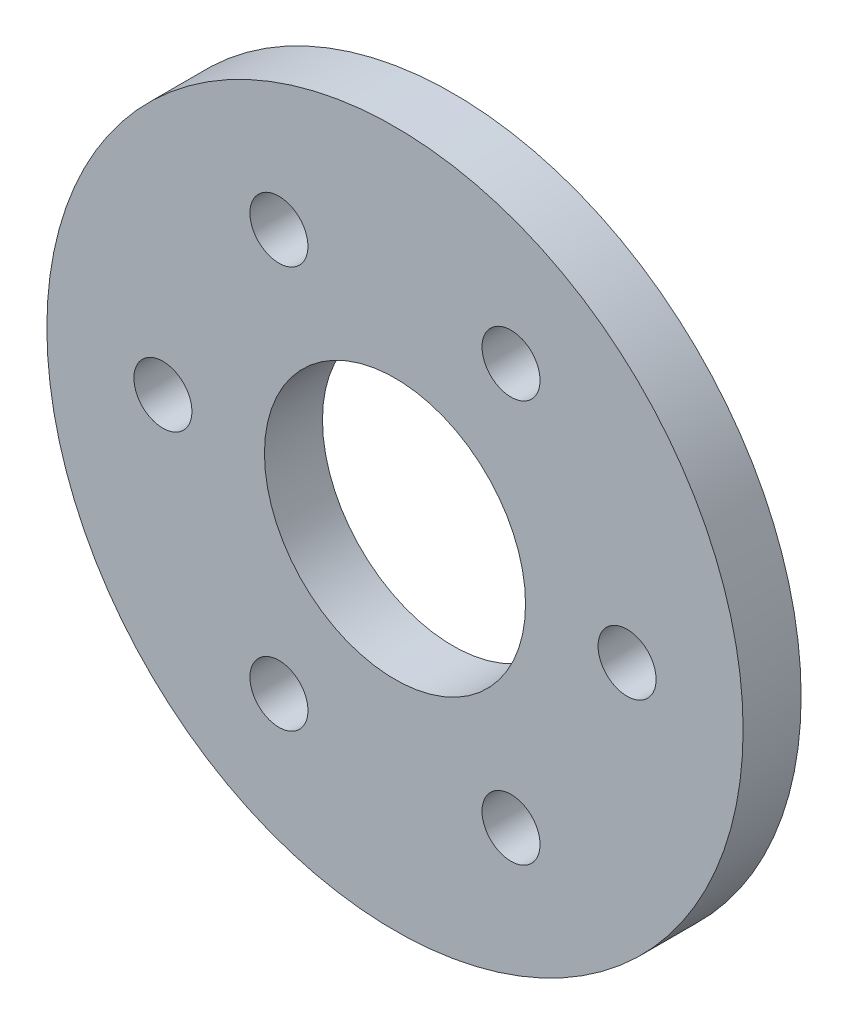
ISO-10303-21;
HEADER;
FILE_DESCRIPTION(('STEP AP214'),'2;1');
FILE_NAME('part.step','',(''),(''),'','','');
FILE_SCHEMA(('AUTOMOTIVE_DESIGN { 1 0 10303 214 1 1 1 1 }'));
ENDSEC;
DATA;
#1=APPLICATION_CONTEXT('core data for automotive mechanical design processes');
#2=APPLICATION_PROTOCOL_DEFINITION('international standard','automotive_design',2000,#1);
#3=PRODUCT_CONTEXT('',#1,'mechanical');
#4=PRODUCT('Part','Part','',(#3));
#5=PRODUCT_RELATED_PRODUCT_CATEGORY('part','',(#4));
#6=PRODUCT_DEFINITION_FORMATION('','',#4);
#7=PRODUCT_DEFINITION_CONTEXT('part definition',#1,'design');
#8=PRODUCT_DEFINITION('design','',#6,#7);
#9=PRODUCT_DEFINITION_SHAPE('','',#8);
#10=(LENGTH_UNIT() NAMED_UNIT(*) SI_UNIT(.MILLI.,.METRE.));
#11=(NAMED_UNIT(*) PLANE_ANGLE_UNIT() SI_UNIT($,.RADIAN.));
#12=(NAMED_UNIT(*) SI_UNIT($,.STERADIAN.) SOLID_ANGLE_UNIT());
#13=UNCERTAINTY_MEASURE_WITH_UNIT(LENGTH_MEASURE(1.E-05),#10,'distance_accuracy_value','');
#14=(GEOMETRIC_REPRESENTATION_CONTEXT(3) GLOBAL_UNCERTAINTY_ASSIGNED_CONTEXT((#13)) GLOBAL_UNIT_ASSIGNED_CONTEXT((#10,
#11,#12)) REPRESENTATION_CONTEXT('',''));
#15=CARTESIAN_POINT('',(0.,0.,0.));
#16=DIRECTION('',(0.,0.,1.));
#17=DIRECTION('',(1.,0.,0.));
#18=AXIS2_PLACEMENT_3D('',#15,#16,#17);
#19=CARTESIAN_POINT('',(0.,0.,6.35));
#20=DIRECTION('',(0.,0.,-1.));
#21=DIRECTION('',(-1.,0.,0.));
#22=AXIS2_PLACEMENT_3D('',#19,#20,#21);
#23=CYLINDRICAL_SURFACE('',#22,38.1);
#24=CARTESIAN_POINT('',(0.,0.,6.35));
#25=DIRECTION('',(0.,0.,1.));
#26=DIRECTION('',(1.,0.,0.));
#27=AXIS2_PLACEMENT_3D('',#24,#25,#26);
#28=CIRCLE('',#27,38.1);
#29=CARTESIAN_POINT('',(38.1,0.,6.35));
#30=VERTEX_POINT('',#29);
#31=EDGE_CURVE('E10',#30,#30,#28,.T.);
#32=ORIENTED_EDGE('',*,*,#31,.F.);
#33=EDGE_LOOP('',(#32));
#34=FACE_BOUND('',#33,.T.);
#35=CARTESIAN_POINT('',(0.,0.,0.));
#36=DIRECTION('',(0.,0.,1.));
#37=DIRECTION('',(1.,0.,0.));
#38=AXIS2_PLACEMENT_3D('',#35,#36,#37);
#39=CIRCLE('',#38,38.1);
#40=CARTESIAN_POINT('',(38.1,0.,0.));
#41=VERTEX_POINT('',#40);
#42=EDGE_CURVE('E46',#41,#41,#39,.T.);
#43=ORIENTED_EDGE('',*,*,#42,.T.);
#44=EDGE_LOOP('',(#43));
#45=FACE_BOUND('',#44,.T.);
#46=ADVANCED_FACE('F43',(#34,#45),#23,.T.);
#47=CARTESIAN_POINT('',(0.,0.,6.35));
#48=DIRECTION('',(0.,0.,1.));
#49=DIRECTION('',(1.,0.,0.));
#50=AXIS2_PLACEMENT_3D('',#47,#48,#49);
#51=PLANE('',#50);
#52=CARTESIAN_POINT('',(0.,0.,6.35));
#53=DIRECTION('',(0.,0.,1.));
#54=DIRECTION('',(1.,0.,0.));
#55=AXIS2_PLACEMENT_3D('',#52,#53,#54);
#56=CIRCLE('',#55,14.2875);
#57=CARTESIAN_POINT('',(14.2875,0.,6.35));
#58=VERTEX_POINT('',#57);
#59=EDGE_CURVE('E105',#58,#58,#56,.T.);
#60=ORIENTED_EDGE('',*,*,#59,.F.);
#61=EDGE_LOOP('',(#60));
#62=FACE_BOUND('',#61,.T.);
#63=CARTESIAN_POINT('',(25.4,0.,6.35));
#64=DIRECTION('',(0.,0.,-1.));
#65=DIRECTION('',(-1.,0.,0.));
#66=AXIS2_PLACEMENT_3D('',#63,#64,#65);
#67=CIRCLE('',#66,3.175);
#68=CARTESIAN_POINT('',(22.225,0.,6.35));
#69=VERTEX_POINT('',#68);
#70=EDGE_CURVE('E55',#69,#69,#67,.T.);
#71=ORIENTED_EDGE('',*,*,#70,.T.);
#72=EDGE_LOOP('',(#71));
#73=FACE_BOUND('',#72,.T.);
#74=CARTESIAN_POINT('',(12.7000000000003,-21.9970452561246,6.35));
#75=DIRECTION('',(0.,0.,-1.));
#76=DIRECTION('',(-1.,0.,0.));
#77=AXIS2_PLACEMENT_3D('',#74,#75,#76);
#78=CIRCLE('',#77,3.175);
#79=CARTESIAN_POINT('',(9.52500000000026,-21.9970452561246,6.35));
#80=VERTEX_POINT('',#79);
#81=EDGE_CURVE('E91',#80,#80,#78,.T.);
#82=ORIENTED_EDGE('',*,*,#81,.T.);
#83=EDGE_LOOP('',(#82));
#84=FACE_BOUND('',#83,.T.);
#85=CARTESIAN_POINT('',(-12.6999999999998,-21.9970452561249,6.35));
#86=DIRECTION('',(0.,0.,-1.));
#87=DIRECTION('',(-1.,0.,0.));
#88=AXIS2_PLACEMENT_3D('',#85,#86,#87);
#89=CIRCLE('',#88,3.175);
#90=CARTESIAN_POINT('',(-15.8749999999998,-21.9970452561249,6.35));
#91=VERTEX_POINT('',#90);
#92=EDGE_CURVE('E57',#91,#91,#89,.T.);
#93=ORIENTED_EDGE('',*,*,#92,.T.);
#94=EDGE_LOOP('',(#93));
#95=FACE_BOUND('',#94,.T.);
#96=CARTESIAN_POINT('',(-25.4,-1.77367252013231E-13,6.35));
#97=DIRECTION('',(0.,0.,-1.));
#98=DIRECTION('',(-1.,0.,0.));
#99=AXIS2_PLACEMENT_3D('',#96,#97,#98);
#100=CIRCLE('',#99,3.175);
#101=CARTESIAN_POINT('',(-28.575,-1.77367252013231E-13,6.35));
#102=VERTEX_POINT('',#101);
#103=EDGE_CURVE('E66',#102,#102,#100,.T.);
#104=ORIENTED_EDGE('',*,*,#103,.T.);
#105=EDGE_LOOP('',(#104));
#106=FACE_BOUND('',#105,.T.);
#107=CARTESIAN_POINT('',(-12.7000000000001,21.9970452561247,6.35));
#108=DIRECTION('',(0.,0.,-1.));
#109=DIRECTION('',(-1.,0.,0.));
#110=AXIS2_PLACEMENT_3D('',#107,#108,#109);
#111=CIRCLE('',#110,3.17500000000001);
#112=CARTESIAN_POINT('',(-15.8750000000001,21.9970452561247,6.35));
#113=VERTEX_POINT('',#112);
#114=EDGE_CURVE('E74',#113,#113,#111,.T.);
#115=ORIENTED_EDGE('',*,*,#114,.T.);
#116=EDGE_LOOP('',(#115));
#117=FACE_BOUND('',#116,.T.);
#118=CARTESIAN_POINT('',(12.6999999999999,21.9970452561248,6.35));
#119=DIRECTION('',(0.,0.,-1.));
#120=DIRECTION('',(-1.,0.,0.));
#121=AXIS2_PLACEMENT_3D('',#118,#119,#120);
#122=CIRCLE('',#121,3.175);
#123=CARTESIAN_POINT('',(9.52499999999995,21.9970452561248,6.35));
#124=VERTEX_POINT('',#123);
#125=EDGE_CURVE('E82',#124,#124,#122,.T.);
#126=ORIENTED_EDGE('',*,*,#125,.T.);
#127=EDGE_LOOP('',(#126));
#128=FACE_BOUND('',#127,.T.);
#129=ORIENTED_EDGE('',*,*,#31,.T.);
#130=EDGE_LOOP('',(#129));
#131=FACE_BOUND('',#130,.T.);
#132=ADVANCED_FACE('F123',(#62,#73,#84,#95,#106,#117,#128,#131),#51,.T.);
#133=CARTESIAN_POINT('',(0.,0.,0.));
#134=DIRECTION('',(0.,0.,1.));
#135=DIRECTION('',(1.,0.,0.));
#136=AXIS2_PLACEMENT_3D('',#133,#134,#135);
#137=PLANE('',#136);
#138=CARTESIAN_POINT('',(0.,0.,0.));
#139=DIRECTION('',(0.,0.,1.));
#140=DIRECTION('',(1.,0.,0.));
#141=AXIS2_PLACEMENT_3D('',#138,#139,#140);
#142=CIRCLE('',#141,14.2875);
#143=CARTESIAN_POINT('',(14.2875,0.,0.));
#144=VERTEX_POINT('',#143);
#145=EDGE_CURVE('E95',#144,#144,#142,.T.);
#146=ORIENTED_EDGE('',*,*,#145,.T.);
#147=EDGE_LOOP('',(#146));
#148=FACE_BOUND('',#147,.T.);
#149=CARTESIAN_POINT('',(25.4,0.,0.));
#150=DIRECTION('',(0.,0.,-1.));
#151=DIRECTION('',(-1.,0.,0.));
#152=AXIS2_PLACEMENT_3D('',#149,#150,#151);
#153=CIRCLE('',#152,3.175);
#154=CARTESIAN_POINT('',(22.225,0.,0.));
#155=VERTEX_POINT('',#154);
#156=EDGE_CURVE('E90',#155,#155,#153,.T.);
#157=ORIENTED_EDGE('',*,*,#156,.F.);
#158=EDGE_LOOP('',(#157));
#159=FACE_BOUND('',#158,.T.);
#160=CARTESIAN_POINT('',(12.7000000000003,-21.9970452561246,0.));
#161=DIRECTION('',(0.,0.,-1.));
#162=DIRECTION('',(-1.,0.,0.));
#163=AXIS2_PLACEMENT_3D('',#160,#161,#162);
#164=CIRCLE('',#163,3.175);
#165=CARTESIAN_POINT('',(9.52500000000026,-21.9970452561246,0.));
#166=VERTEX_POINT('',#165);
#167=EDGE_CURVE('E62',#166,#166,#164,.T.);
#168=ORIENTED_EDGE('',*,*,#167,.F.);
#169=EDGE_LOOP('',(#168));
#170=FACE_BOUND('',#169,.T.);
#171=CARTESIAN_POINT('',(-12.6999999999998,-21.9970452561249,0.));
#172=DIRECTION('',(0.,0.,-1.));
#173=DIRECTION('',(-1.,0.,0.));
#174=AXIS2_PLACEMENT_3D('',#171,#172,#173);
#175=CIRCLE('',#174,3.175);
#176=CARTESIAN_POINT('',(-15.8749999999998,-21.9970452561249,0.));
#177=VERTEX_POINT('',#176);
#178=EDGE_CURVE('E61',#177,#177,#175,.T.);
#179=ORIENTED_EDGE('',*,*,#178,.F.);
#180=EDGE_LOOP('',(#179));
#181=FACE_BOUND('',#180,.T.);
#182=CARTESIAN_POINT('',(-25.4,-1.77367252013231E-13,0.));
#183=DIRECTION('',(0.,0.,-1.));
#184=DIRECTION('',(-1.,0.,0.));
#185=AXIS2_PLACEMENT_3D('',#182,#183,#184);
#186=CIRCLE('',#185,3.175);
#187=CARTESIAN_POINT('',(-28.575,-1.77367252013231E-13,0.));
#188=VERTEX_POINT('',#187);
#189=EDGE_CURVE('E70',#188,#188,#186,.T.);
#190=ORIENTED_EDGE('',*,*,#189,.F.);
#191=EDGE_LOOP('',(#190));
#192=FACE_BOUND('',#191,.T.);
#193=CARTESIAN_POINT('',(-12.7000000000001,21.9970452561247,0.));
#194=DIRECTION('',(0.,0.,-1.));
#195=DIRECTION('',(-1.,0.,0.));
#196=AXIS2_PLACEMENT_3D('',#193,#194,#195);
#197=CIRCLE('',#196,3.17500000000001);
#198=CARTESIAN_POINT('',(-15.8750000000001,21.9970452561247,0.));
#199=VERTEX_POINT('',#198);
#200=EDGE_CURVE('E78',#199,#199,#197,.T.);
#201=ORIENTED_EDGE('',*,*,#200,.F.);
#202=EDGE_LOOP('',(#201));
#203=FACE_BOUND('',#202,.T.);
#204=CARTESIAN_POINT('',(12.6999999999999,21.9970452561248,0.));
#205=DIRECTION('',(0.,0.,-1.));
#206=DIRECTION('',(-1.,0.,0.));
#207=AXIS2_PLACEMENT_3D('',#204,#205,#206);
#208=CIRCLE('',#207,3.175);
#209=CARTESIAN_POINT('',(9.52499999999995,21.9970452561248,0.));
#210=VERTEX_POINT('',#209);
#211=EDGE_CURVE('E86',#210,#210,#208,.T.);
#212=ORIENTED_EDGE('',*,*,#211,.F.);
#213=EDGE_LOOP('',(#212));
#214=FACE_BOUND('',#213,.T.);
#215=ORIENTED_EDGE('',*,*,#42,.F.);
#216=EDGE_LOOP('',(#215));
#217=FACE_BOUND('',#216,.T.);
#218=ADVANCED_FACE('F113',(#148,#159,#170,#181,#192,#203,#214,#217),#137,.F.);
#219=CARTESIAN_POINT('',(12.6999999999999,21.9970452561248,6.35));
#220=DIRECTION('',(0.,0.,-1.));
#221=DIRECTION('',(-1.,0.,0.));
#222=AXIS2_PLACEMENT_3D('',#219,#220,#221);
#223=CYLINDRICAL_SURFACE('',#222,3.175);
#224=ORIENTED_EDGE('',*,*,#125,.F.);
#225=EDGE_LOOP('',(#224));
#226=FACE_BOUND('',#225,.T.);
#227=ORIENTED_EDGE('',*,*,#211,.T.);
#228=EDGE_LOOP('',(#227));
#229=FACE_BOUND('',#228,.T.);
#230=ADVANCED_FACE('F139',(#226,#229),#223,.F.);
#231=CARTESIAN_POINT('',(-12.7000000000001,21.9970452561247,6.35));
#232=DIRECTION('',(0.,0.,-1.));
#233=DIRECTION('',(-1.,0.,0.));
#234=AXIS2_PLACEMENT_3D('',#231,#232,#233);
#235=CYLINDRICAL_SURFACE('',#234,3.17500000000001);
#236=ORIENTED_EDGE('',*,*,#114,.F.);
#237=EDGE_LOOP('',(#236));
#238=FACE_BOUND('',#237,.T.);
#239=ORIENTED_EDGE('',*,*,#200,.T.);
#240=EDGE_LOOP('',(#239));
#241=FACE_BOUND('',#240,.T.);
#242=ADVANCED_FACE('F142',(#238,#241),#235,.F.);
#243=CARTESIAN_POINT('',(-25.4,-1.77367252013231E-13,6.35));
#244=DIRECTION('',(0.,0.,-1.));
#245=DIRECTION('',(-1.,0.,0.));
#246=AXIS2_PLACEMENT_3D('',#243,#244,#245);
#247=CYLINDRICAL_SURFACE('',#246,3.175);
#248=ORIENTED_EDGE('',*,*,#103,.F.);
#249=EDGE_LOOP('',(#248));
#250=FACE_BOUND('',#249,.T.);
#251=ORIENTED_EDGE('',*,*,#189,.T.);
#252=EDGE_LOOP('',(#251));
#253=FACE_BOUND('',#252,.T.);
#254=ADVANCED_FACE('F172',(#250,#253),#247,.F.);
#255=CARTESIAN_POINT('',(-12.6999999999998,-21.9970452561249,6.35));
#256=DIRECTION('',(0.,0.,-1.));
#257=DIRECTION('',(-1.,0.,0.));
#258=AXIS2_PLACEMENT_3D('',#255,#256,#257);
#259=CYLINDRICAL_SURFACE('',#258,3.175);
#260=ORIENTED_EDGE('',*,*,#92,.F.);
#261=EDGE_LOOP('',(#260));
#262=FACE_BOUND('',#261,.T.);
#263=ORIENTED_EDGE('',*,*,#178,.T.);
#264=EDGE_LOOP('',(#263));
#265=FACE_BOUND('',#264,.T.);
#266=ADVANCED_FACE('F180',(#262,#265),#259,.F.);
#267=CARTESIAN_POINT('',(12.7000000000003,-21.9970452561246,6.35));
#268=DIRECTION('',(0.,0.,-1.));
#269=DIRECTION('',(-1.,0.,0.));
#270=AXIS2_PLACEMENT_3D('',#267,#268,#269);
#271=CYLINDRICAL_SURFACE('',#270,3.175);
#272=ORIENTED_EDGE('',*,*,#81,.F.);
#273=EDGE_LOOP('',(#272));
#274=FACE_BOUND('',#273,.T.);
#275=ORIENTED_EDGE('',*,*,#167,.T.);
#276=EDGE_LOOP('',(#275));
#277=FACE_BOUND('',#276,.T.);
#278=ADVANCED_FACE('F188',(#274,#277),#271,.F.);
#279=CARTESIAN_POINT('',(25.4,0.,6.35));
#280=DIRECTION('',(0.,0.,-1.));
#281=DIRECTION('',(-1.,0.,0.));
#282=AXIS2_PLACEMENT_3D('',#279,#280,#281);
#283=CYLINDRICAL_SURFACE('',#282,3.175);
#284=ORIENTED_EDGE('',*,*,#70,.F.);
#285=EDGE_LOOP('',(#284));
#286=FACE_BOUND('',#285,.T.);
#287=ORIENTED_EDGE('',*,*,#156,.T.);
#288=EDGE_LOOP('',(#287));
#289=FACE_BOUND('',#288,.T.);
#290=ADVANCED_FACE('F119',(#286,#289),#283,.F.);
#291=CARTESIAN_POINT('',(0.,0.,0.));
#292=DIRECTION('',(0.,0.,1.));
#293=DIRECTION('',(1.,0.,0.));
#294=AXIS2_PLACEMENT_3D('',#291,#292,#293);
#295=CYLINDRICAL_SURFACE('',#294,14.2875);
#296=ORIENTED_EDGE('',*,*,#145,.F.);
#297=EDGE_LOOP('',(#296));
#298=FACE_BOUND('',#297,.T.);
#299=ORIENTED_EDGE('',*,*,#59,.T.);
#300=EDGE_LOOP('',(#299));
#301=FACE_BOUND('',#300,.T.);
#302=ADVANCED_FACE('F116',(#298,#301),#295,.F.);
#303=CLOSED_SHELL('',(#46,#132,#218,#230,#242,#254,#266,#278,#290,#302));
#304=MANIFOLD_SOLID_BREP('B2',#303);
#305=ADVANCED_BREP_SHAPE_REPRESENTATION('',(#18,#304),#14);
#306=SHAPE_DEFINITION_REPRESENTATION(#9,#305);
ENDSEC;
END-ISO-10303-21;
